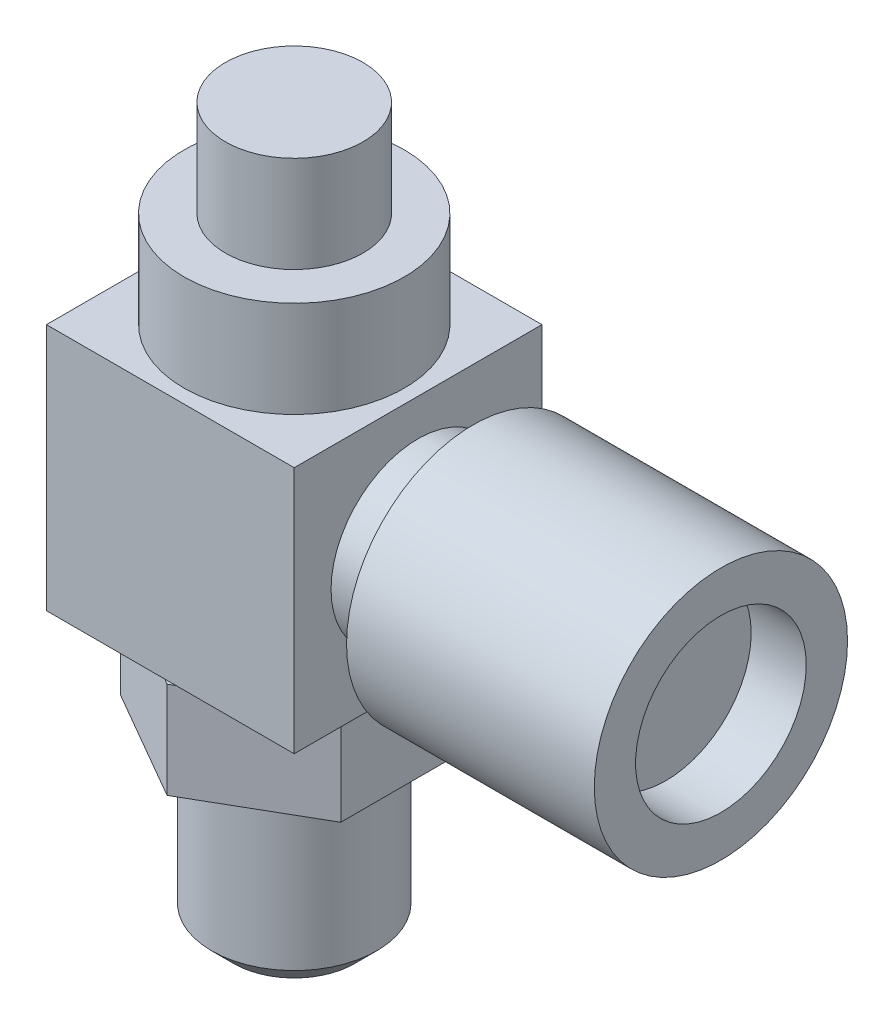
ISO-10303-21;
HEADER;
FILE_DESCRIPTION(('STEP AP214'),'2;1');
FILE_NAME('part.step','',(''),(''),'','','');
FILE_SCHEMA(('AUTOMOTIVE_DESIGN { 1 0 10303 214 1 1 1 1 }'));
ENDSEC;
DATA;
#1=APPLICATION_CONTEXT('core data for automotive mechanical design processes');
#2=APPLICATION_PROTOCOL_DEFINITION('international standard','automotive_design',2000,#1);
#3=PRODUCT_CONTEXT('',#1,'mechanical');
#4=PRODUCT('Part','Part','',(#3));
#5=PRODUCT_RELATED_PRODUCT_CATEGORY('part','',(#4));
#6=PRODUCT_DEFINITION_FORMATION('','',#4);
#7=PRODUCT_DEFINITION_CONTEXT('part definition',#1,'design');
#8=PRODUCT_DEFINITION('design','',#6,#7);
#9=PRODUCT_DEFINITION_SHAPE('','',#8);
#10=(LENGTH_UNIT() NAMED_UNIT(*) SI_UNIT(.MILLI.,.METRE.));
#11=(NAMED_UNIT(*) PLANE_ANGLE_UNIT() SI_UNIT($,.RADIAN.));
#12=(NAMED_UNIT(*) SI_UNIT($,.STERADIAN.) SOLID_ANGLE_UNIT());
#13=UNCERTAINTY_MEASURE_WITH_UNIT(LENGTH_MEASURE(1.E-05),#10,'distance_accuracy_value','');
#14=(GEOMETRIC_REPRESENTATION_CONTEXT(3) GLOBAL_UNCERTAINTY_ASSIGNED_CONTEXT((#13)) GLOBAL_UNIT_ASSIGNED_CONTEXT((#10,
#11,#12)) REPRESENTATION_CONTEXT('',''));
#15=CARTESIAN_POINT('',(0.,0.,0.));
#16=DIRECTION('',(0.,0.,1.));
#17=DIRECTION('',(1.,0.,0.));
#18=AXIS2_PLACEMENT_3D('',#15,#16,#17);
#19=CARTESIAN_POINT('',(0.,-16.,4.61880215351701));
#20=DIRECTION('',(0.,1.,0.));
#21=DIRECTION('',(0.,0.,1.));
#22=AXIS2_PLACEMENT_3D('',#19,#20,#21);
#23=PLANE('',#22);
#24=CARTESIAN_POINT('',(0.,-16.,0.));
#25=DIRECTION('',(0.,1.,0.));
#26=DIRECTION('',(0.,0.,1.));
#27=AXIS2_PLACEMENT_3D('',#24,#25,#26);
#28=CIRCLE('',#27,2.);
#29=CARTESIAN_POINT('',(0.,-16.,2.));
#30=VERTEX_POINT('',#29);
#31=EDGE_CURVE('E19',#30,#30,#28,.F.);
#32=ORIENTED_EDGE('',*,*,#31,.T.);
#33=EDGE_LOOP('',(#32));
#34=FACE_BOUND('',#33,.T.);
#35=ADVANCED_FACE('F16',(#34),#23,.F.);
#36=CARTESIAN_POINT('',(0.,-22.5,0.));
#37=DIRECTION('',(0.,1.,0.));
#38=DIRECTION('',(0.,0.,1.));
#39=AXIS2_PLACEMENT_3D('',#36,#37,#38);
#40=CYLINDRICAL_SURFACE('',#39,2.);
#41=CARTESIAN_POINT('',(0.,-22.5,0.));
#42=DIRECTION('',(0.,1.,0.));
#43=DIRECTION('',(0.,0.,1.));
#44=AXIS2_PLACEMENT_3D('',#41,#42,#43);
#45=CIRCLE('',#44,2.);
#46=CARTESIAN_POINT('',(0.,-22.5,2.));
#47=VERTEX_POINT('',#46);
#48=EDGE_CURVE('E172',#47,#47,#45,.T.);
#49=ORIENTED_EDGE('',*,*,#48,.F.);
#50=EDGE_LOOP('',(#49));
#51=FACE_BOUND('',#50,.T.);
#52=ORIENTED_EDGE('',*,*,#31,.F.);
#53=EDGE_LOOP('',(#52));
#54=FACE_BOUND('',#53,.T.);
#55=ADVANCED_FACE('F180',(#51,#54),#40,.F.);
#56=CARTESIAN_POINT('',(0.,-22.5,0.));
#57=DIRECTION('',(0.,-1.,0.));
#58=DIRECTION('',(0.,0.,-1.));
#59=AXIS2_PLACEMENT_3D('',#56,#57,#58);
#60=PLANE('',#59);
#61=ORIENTED_EDGE('',*,*,#48,.T.);
#62=EDGE_LOOP('',(#61));
#63=FACE_BOUND('',#62,.T.);
#64=CARTESIAN_POINT('',(0.,-22.4999999999795,0.));
#65=DIRECTION('',(0.,1.,0.));
#66=DIRECTION('',(0.,0.,1.));
#67=AXIS2_PLACEMENT_3D('',#64,#65,#66);
#68=CIRCLE('',#67,2.20000000001619);
#69=CARTESIAN_POINT('',(0.,-22.4999999999795,2.20000000001619));
#70=VERTEX_POINT('',#69);
#71=EDGE_CURVE('E137',#70,#70,#68,.T.);
#72=ORIENTED_EDGE('',*,*,#71,.F.);
#73=EDGE_LOOP('',(#72));
#74=FACE_BOUND('',#73,.T.);
#75=ADVANCED_FACE('F182',(#63,#74),#60,.T.);
#76=CARTESIAN_POINT('',(0.,-21.7000000000667,0.));
#77=DIRECTION('',(0.,1.,0.));
#78=DIRECTION('',(0.,0.,1.));
#79=AXIS2_PLACEMENT_3D('',#76,#77,#78);
#80=CONICAL_SURFACE('',#79,2.9999999999859,0.785398163432975);
#81=ORIENTED_EDGE('',*,*,#71,.T.);
#82=EDGE_LOOP('',(#81));
#83=FACE_BOUND('',#82,.T.);
#84=CARTESIAN_POINT('',(0.,-21.7,0.));
#85=DIRECTION('',(0.,1.,0.));
#86=DIRECTION('',(0.,0.,1.));
#87=AXIS2_PLACEMENT_3D('',#84,#85,#86);
#88=CIRCLE('',#87,3.);
#89=CARTESIAN_POINT('',(0.,-21.7,3.));
#90=VERTEX_POINT('',#89);
#91=EDGE_CURVE('E134',#90,#90,#88,.T.);
#92=ORIENTED_EDGE('',*,*,#91,.F.);
#93=EDGE_LOOP('',(#92));
#94=FACE_BOUND('',#93,.T.);
#95=ADVANCED_FACE('F189',(#83,#94),#80,.T.);
#96=CARTESIAN_POINT('',(0.,3.5,0.));
#97=DIRECTION('',(0.,1.,0.));
#98=DIRECTION('',(0.,0.,1.));
#99=AXIS2_PLACEMENT_3D('',#96,#97,#98);
#100=PLANE('',#99);
#101=CARTESIAN_POINT('',(0.,3.5,0.));
#102=DIRECTION('',(0.,-1.,0.));
#103=DIRECTION('',(0.,0.,-1.));
#104=AXIS2_PLACEMENT_3D('',#101,#102,#103);
#105=CIRCLE('',#104,2.5);
#106=CARTESIAN_POINT('',(0.,3.5,-2.5));
#107=VERTEX_POINT('',#106);
#108=EDGE_CURVE('E136',#107,#107,#105,.T.);
#109=ORIENTED_EDGE('',*,*,#108,.F.);
#110=EDGE_LOOP('',(#109));
#111=FACE_BOUND('',#110,.T.);
#112=ADVANCED_FACE('F292',(#111),#100,.T.);
#113=CARTESIAN_POINT('',(0.,-22.5,0.));
#114=DIRECTION('',(0.,1.,0.));
#115=DIRECTION('',(0.,0.,1.));
#116=AXIS2_PLACEMENT_3D('',#113,#114,#115);
#117=CYLINDRICAL_SURFACE('',#116,3.);
#118=ORIENTED_EDGE('',*,*,#91,.T.);
#119=EDGE_LOOP('',(#118));
#120=FACE_BOUND('',#119,.T.);
#121=CARTESIAN_POINT('',(0.,-16.,0.));
#122=DIRECTION('',(0.,1.,0.));
#123=DIRECTION('',(0.,0.,1.));
#124=AXIS2_PLACEMENT_3D('',#121,#122,#123);
#125=CIRCLE('',#124,3.);
#126=CARTESIAN_POINT('',(0.,-16.,3.));
#127=VERTEX_POINT('',#126);
#128=EDGE_CURVE('E114',#127,#127,#125,.F.);
#129=ORIENTED_EDGE('',*,*,#128,.T.);
#130=EDGE_LOOP('',(#129));
#131=FACE_BOUND('',#130,.T.);
#132=ADVANCED_FACE('F288',(#120,#131),#117,.T.);
#133=CARTESIAN_POINT('',(0.,3.5,0.));
#134=DIRECTION('',(0.,-1.,0.));
#135=DIRECTION('',(0.,0.,-1.));
#136=AXIS2_PLACEMENT_3D('',#133,#134,#135);
#137=CYLINDRICAL_SURFACE('',#136,2.5);
#138=CARTESIAN_POINT('',(0.,0.,0.));
#139=DIRECTION('',(0.,-1.,0.));
#140=DIRECTION('',(0.,0.,-1.));
#141=AXIS2_PLACEMENT_3D('',#138,#139,#140);
#142=CIRCLE('',#141,2.5);
#143=CARTESIAN_POINT('',(0.,0.,-2.5));
#144=VERTEX_POINT('',#143);
#145=EDGE_CURVE('E129',#144,#144,#142,.F.);
#146=ORIENTED_EDGE('',*,*,#145,.T.);
#147=EDGE_LOOP('',(#146));
#148=FACE_BOUND('',#147,.T.);
#149=ORIENTED_EDGE('',*,*,#108,.T.);
#150=EDGE_LOOP('',(#149));
#151=FACE_BOUND('',#150,.T.);
#152=ADVANCED_FACE('F284',(#148,#151),#137,.T.);
#153=CARTESIAN_POINT('',(0.,-16.,4.61880215351701));
#154=DIRECTION('',(0.,1.,0.));
#155=DIRECTION('',(0.,0.,1.));
#156=AXIS2_PLACEMENT_3D('',#153,#154,#155);
#157=PLANE('',#156);
#158=ORIENTED_EDGE('',*,*,#128,.F.);
#159=EDGE_LOOP('',(#158));
#160=FACE_BOUND('',#159,.T.);
#161=DIRECTION('',(0.,0.,-1.));
#162=VECTOR('',#161,1.);
#163=CARTESIAN_POINT('',(-4.,-16.,-2.3094010767585));
#164=LINE('',#163,#162);
#165=CARTESIAN_POINT('',(-4.,-16.,2.3094010767585));
#166=VERTEX_POINT('',#165);
#167=CARTESIAN_POINT('',(-4.,-16.,-2.3094010767585));
#168=VERTEX_POINT('',#167);
#169=EDGE_CURVE('E103',#166,#168,#164,.T.);
#170=ORIENTED_EDGE('',*,*,#169,.T.);
#171=DIRECTION('',(0.866025403784439,0.,-0.5));
#172=VECTOR('',#171,1.);
#173=CARTESIAN_POINT('',(0.,-16.,-4.61880215351701));
#174=LINE('',#173,#172);
#175=CARTESIAN_POINT('',(0.,-16.,-4.61880215351701));
#176=VERTEX_POINT('',#175);
#177=EDGE_CURVE('E113',#168,#176,#174,.T.);
#178=ORIENTED_EDGE('',*,*,#177,.T.);
#179=DIRECTION('',(0.866025403784439,0.,0.5));
#180=VECTOR('',#179,1.);
#181=CARTESIAN_POINT('',(4.,-16.,-2.3094010767585));
#182=LINE('',#181,#180);
#183=CARTESIAN_POINT('',(4.,-16.,-2.3094010767585));
#184=VERTEX_POINT('',#183);
#185=EDGE_CURVE('E554',#176,#184,#182,.T.);
#186=ORIENTED_EDGE('',*,*,#185,.T.);
#187=DIRECTION('',(0.,0.,1.));
#188=VECTOR('',#187,1.);
#189=CARTESIAN_POINT('',(4.,-16.,2.3094010767585));
#190=LINE('',#189,#188);
#191=CARTESIAN_POINT('',(4.,-16.,2.3094010767585));
#192=VERTEX_POINT('',#191);
#193=EDGE_CURVE('E558',#184,#192,#190,.T.);
#194=ORIENTED_EDGE('',*,*,#193,.T.);
#195=DIRECTION('',(-0.866025403784438,0.,0.5));
#196=VECTOR('',#195,1.);
#197=CARTESIAN_POINT('',(0.,-16.,4.61880215351701));
#198=LINE('',#197,#196);
#199=CARTESIAN_POINT('',(0.,-16.,4.61880215351701));
#200=VERTEX_POINT('',#199);
#201=EDGE_CURVE('E110',#192,#200,#198,.T.);
#202=ORIENTED_EDGE('',*,*,#201,.T.);
#203=DIRECTION('',(-0.866025403784438,0.,-0.500000000000001));
#204=VECTOR('',#203,1.);
#205=CARTESIAN_POINT('',(-4.,-16.,2.3094010767585));
#206=LINE('',#205,#204);
#207=EDGE_CURVE('E106',#200,#166,#206,.T.);
#208=ORIENTED_EDGE('',*,*,#207,.T.);
#209=EDGE_LOOP('',(#170,#178,#186,#194,#202,#208));
#210=FACE_BOUND('',#209,.T.);
#211=ADVANCED_FACE('F108',(#160,#210),#157,.F.);
#212=CARTESIAN_POINT('',(-4.,-16.,2.3094010767585));
#213=DIRECTION('',(0.500000000000001,0.,-0.866025403784438));
#214=DIRECTION('',(-0.866025403784438,0.,-0.500000000000001));
#215=AXIS2_PLACEMENT_3D('',#212,#213,#214);
#216=PLANE('',#215);
#217=DIRECTION('',(0.866025403784438,0.,0.500000000000001));
#218=VECTOR('',#217,1.);
#219=CARTESIAN_POINT('',(-4.,-12.5,2.3094010767585));
#220=LINE('',#219,#218);
#221=CARTESIAN_POINT('',(-4.,-12.5,2.3094010767585));
#222=VERTEX_POINT('',#221);
#223=CARTESIAN_POINT('',(-0.20577136594006,-12.5,4.5));
#224=VERTEX_POINT('',#223);
#225=EDGE_CURVE('E120',#222,#224,#220,.T.);
#226=ORIENTED_EDGE('',*,*,#225,.F.);
#227=DIRECTION('',(0.,1.,0.));
#228=VECTOR('',#227,1.);
#229=CARTESIAN_POINT('',(-4.,-16.,2.3094010767585));
#230=LINE('',#229,#228);
#231=EDGE_CURVE('E117',#222,#166,#230,.F.);
#232=ORIENTED_EDGE('',*,*,#231,.T.);
#233=ORIENTED_EDGE('',*,*,#207,.F.);
#234=DIRECTION('',(0.,1.,0.));
#235=VECTOR('',#234,1.);
#236=CARTESIAN_POINT('',(0.,-16.,4.61880215351701));
#237=LINE('',#236,#235);
#238=CARTESIAN_POINT('',(0.,-12.5,4.61880215351701));
#239=VERTEX_POINT('',#238);
#240=EDGE_CURVE('E563',#200,#239,#237,.T.);
#241=ORIENTED_EDGE('',*,*,#240,.T.);
#242=DIRECTION('',(0.86602540378444,0.,0.499999999999998));
#243=VECTOR('',#242,1.);
#244=CARTESIAN_POINT('',(-0.20577136594006,-12.5,4.5));
#245=LINE('',#244,#243);
#246=EDGE_CURVE('E567',#224,#239,#245,.T.);
#247=ORIENTED_EDGE('',*,*,#246,.F.);
#248=EDGE_LOOP('',(#226,#232,#233,#241,#247));
#249=FACE_BOUND('',#248,.T.);
#250=ADVANCED_FACE('F118',(#249),#216,.F.);
#251=CARTESIAN_POINT('',(0.,-16.,-4.61880215351701));
#252=DIRECTION('',(0.5,0.,0.866025403784439));
#253=DIRECTION('',(0.866025403784439,0.,-0.5));
#254=AXIS2_PLACEMENT_3D('',#251,#252,#253);
#255=PLANE('',#254);
#256=DIRECTION('',(-0.866025403784437,0.,0.500000000000003));
#257=VECTOR('',#256,1.);
#258=CARTESIAN_POINT('',(0.,-12.5,-4.61880215351701));
#259=LINE('',#258,#257);
#260=CARTESIAN_POINT('',(0.,-12.5,-4.61880215351701));
#261=VERTEX_POINT('',#260);
#262=CARTESIAN_POINT('',(-0.205771365940048,-12.5,-4.5));
#263=VERTEX_POINT('',#262);
#264=EDGE_CURVE('E166',#261,#263,#259,.T.);
#265=ORIENTED_EDGE('',*,*,#264,.F.);
#266=DIRECTION('',(0.,1.,0.));
#267=VECTOR('',#266,1.);
#268=CARTESIAN_POINT('',(0.,-16.,-4.61880215351701));
#269=LINE('',#268,#267);
#270=EDGE_CURVE('E539',#261,#176,#269,.F.);
#271=ORIENTED_EDGE('',*,*,#270,.T.);
#272=ORIENTED_EDGE('',*,*,#177,.F.);
#273=DIRECTION('',(0.,1.,0.));
#274=VECTOR('',#273,1.);
#275=CARTESIAN_POINT('',(-4.,-16.,-2.3094010767585));
#276=LINE('',#275,#274);
#277=CARTESIAN_POINT('',(-4.,-12.5,-2.3094010767585));
#278=VERTEX_POINT('',#277);
#279=EDGE_CURVE('E127',#168,#278,#276,.T.);
#280=ORIENTED_EDGE('',*,*,#279,.T.);
#281=DIRECTION('',(-0.866025403784439,0.,0.5));
#282=VECTOR('',#281,1.);
#283=CARTESIAN_POINT('',(-0.205771365940047,-12.5,-4.5));
#284=LINE('',#283,#282);
#285=EDGE_CURVE('E542',#263,#278,#284,.T.);
#286=ORIENTED_EDGE('',*,*,#285,.F.);
#287=EDGE_LOOP('',(#265,#271,#272,#280,#286));
#288=FACE_BOUND('',#287,.T.);
#289=ADVANCED_FACE('F276',(#288),#255,.F.);
#290=CARTESIAN_POINT('',(-4.,-16.,-2.3094010767585));
#291=DIRECTION('',(1.,0.,0.));
#292=DIRECTION('',(0.,0.,-1.));
#293=AXIS2_PLACEMENT_3D('',#290,#291,#292);
#294=PLANE('',#293);
#295=ORIENTED_EDGE('',*,*,#279,.F.);
#296=ORIENTED_EDGE('',*,*,#169,.F.);
#297=ORIENTED_EDGE('',*,*,#231,.F.);
#298=DIRECTION('',(0.,0.,-1.));
#299=VECTOR('',#298,1.);
#300=CARTESIAN_POINT('',(-4.,-12.5,-4.5));
#301=LINE('',#300,#299);
#302=EDGE_CURVE('E599',#278,#222,#301,.F.);
#303=ORIENTED_EDGE('',*,*,#302,.F.);
#304=EDGE_LOOP('',(#295,#296,#297,#303));
#305=FACE_BOUND('',#304,.T.);
#306=ADVANCED_FACE('F126',(#305),#294,.F.);
#307=CARTESIAN_POINT('',(0.,0.,0.));
#308=DIRECTION('',(0.,-1.,0.));
#309=DIRECTION('',(0.,0.,-1.));
#310=AXIS2_PLACEMENT_3D('',#307,#308,#309);
#311=PLANE('',#310);
#312=ORIENTED_EDGE('',*,*,#145,.F.);
#313=EDGE_LOOP('',(#312));
#314=FACE_BOUND('',#313,.T.);
#315=CARTESIAN_POINT('',(0.,0.,0.));
#316=DIRECTION('',(0.,1.,0.));
#317=DIRECTION('',(0.,0.,1.));
#318=AXIS2_PLACEMENT_3D('',#315,#316,#317);
#319=CIRCLE('',#318,4.);
#320=CARTESIAN_POINT('',(0.,0.,4.));
#321=VERTEX_POINT('',#320);
#322=EDGE_CURVE('E159',#321,#321,#319,.F.);
#323=ORIENTED_EDGE('',*,*,#322,.F.);
#324=EDGE_LOOP('',(#323));
#325=FACE_BOUND('',#324,.T.);
#326=ADVANCED_FACE('F269',(#314,#325),#311,.F.);
#327=CARTESIAN_POINT('',(0.,-12.5,4.61880215351701));
#328=DIRECTION('',(0.,1.,0.));
#329=DIRECTION('',(0.,0.,1.));
#330=AXIS2_PLACEMENT_3D('',#327,#328,#329);
#331=PLANE('',#330);
#332=DIRECTION('',(1.,0.,0.));
#333=VECTOR('',#332,1.);
#334=CARTESIAN_POINT('',(-4.5,-12.5,-4.5));
#335=LINE('',#334,#333);
#336=CARTESIAN_POINT('',(0.205771365940052,-12.5,-4.5));
#337=VERTEX_POINT('',#336);
#338=EDGE_CURVE('E547',#263,#337,#335,.T.);
#339=ORIENTED_EDGE('',*,*,#338,.T.);
#340=DIRECTION('',(0.866025403784439,0.,0.5));
#341=VECTOR('',#340,1.);
#342=CARTESIAN_POINT('',(4.,-12.5,-2.3094010767585));
#343=LINE('',#342,#341);
#344=EDGE_CURVE('E546',#337,#261,#343,.F.);
#345=ORIENTED_EDGE('',*,*,#344,.T.);
#346=ORIENTED_EDGE('',*,*,#264,.T.);
#347=EDGE_LOOP('',(#339,#345,#346));
#348=FACE_BOUND('',#347,.T.);
#349=ADVANCED_FACE('F265',(#348),#331,.T.);
#350=CARTESIAN_POINT('',(0.,-16.,4.61880215351701));
#351=DIRECTION('',(-0.5,0.,-0.866025403784438));
#352=DIRECTION('',(-0.866025403784438,0.,0.5));
#353=AXIS2_PLACEMENT_3D('',#350,#351,#352);
#354=PLANE('',#353);
#355=DIRECTION('',(0.866025403784442,0.,-0.499999999999993));
#356=VECTOR('',#355,1.);
#357=CARTESIAN_POINT('',(0.,-12.5,4.61880215351701));
#358=LINE('',#357,#356);
#359=CARTESIAN_POINT('',(0.205771365940061,-12.5,4.5));
#360=VERTEX_POINT('',#359);
#361=EDGE_CURVE('E550',#239,#360,#358,.T.);
#362=ORIENTED_EDGE('',*,*,#361,.F.);
#363=ORIENTED_EDGE('',*,*,#240,.F.);
#364=ORIENTED_EDGE('',*,*,#201,.F.);
#365=DIRECTION('',(0.,1.,0.));
#366=VECTOR('',#365,1.);
#367=CARTESIAN_POINT('',(4.,-16.,2.3094010767585));
#368=LINE('',#367,#366);
#369=CARTESIAN_POINT('',(4.,-12.5,2.3094010767585));
#370=VERTEX_POINT('',#369);
#371=EDGE_CURVE('E555',#192,#370,#368,.T.);
#372=ORIENTED_EDGE('',*,*,#371,.T.);
#373=DIRECTION('',(0.866025403784438,0.,-0.500000000000001));
#374=VECTOR('',#373,1.);
#375=CARTESIAN_POINT('',(0.205771365940063,-12.5,4.5));
#376=LINE('',#375,#374);
#377=EDGE_CURVE('E571',#360,#370,#376,.T.);
#378=ORIENTED_EDGE('',*,*,#377,.F.);
#379=EDGE_LOOP('',(#362,#363,#364,#372,#378));
#380=FACE_BOUND('',#379,.T.);
#381=ADVANCED_FACE('F261',(#380),#354,.F.);
#382=CARTESIAN_POINT('',(4.,-16.,2.3094010767585));
#383=DIRECTION('',(-1.,0.,0.));
#384=DIRECTION('',(0.,0.,1.));
#385=AXIS2_PLACEMENT_3D('',#382,#383,#384);
#386=PLANE('',#385);
#387=ORIENTED_EDGE('',*,*,#371,.F.);
#388=ORIENTED_EDGE('',*,*,#193,.F.);
#389=DIRECTION('',(0.,1.,0.));
#390=VECTOR('',#389,1.);
#391=CARTESIAN_POINT('',(4.,-16.,-2.3094010767585));
#392=LINE('',#391,#390);
#393=CARTESIAN_POINT('',(4.,-12.5,-2.3094010767585));
#394=VERTEX_POINT('',#393);
#395=EDGE_CURVE('E551',#184,#394,#392,.T.);
#396=ORIENTED_EDGE('',*,*,#395,.T.);
#397=DIRECTION('',(0.,0.,-1.));
#398=VECTOR('',#397,1.);
#399=CARTESIAN_POINT('',(4.,-12.5,-4.5));
#400=LINE('',#399,#398);
#401=EDGE_CURVE('E583',#370,#394,#400,.T.);
#402=ORIENTED_EDGE('',*,*,#401,.F.);
#403=EDGE_LOOP('',(#387,#388,#396,#402));
#404=FACE_BOUND('',#403,.T.);
#405=ADVANCED_FACE('F257',(#404),#386,.F.);
#406=CARTESIAN_POINT('',(4.,-16.,-2.3094010767585));
#407=DIRECTION('',(-0.5,0.,0.866025403784439));
#408=DIRECTION('',(0.866025403784439,0.,0.5));
#409=AXIS2_PLACEMENT_3D('',#406,#407,#408);
#410=PLANE('',#409);
#411=DIRECTION('',(-0.866025403784439,0.,-0.5));
#412=VECTOR('',#411,1.);
#413=CARTESIAN_POINT('',(4.,-12.5,-2.3094010767585));
#414=LINE('',#413,#412);
#415=EDGE_CURVE('E585',#394,#337,#414,.T.);
#416=ORIENTED_EDGE('',*,*,#415,.F.);
#417=ORIENTED_EDGE('',*,*,#395,.F.);
#418=ORIENTED_EDGE('',*,*,#185,.F.);
#419=ORIENTED_EDGE('',*,*,#270,.F.);
#420=ORIENTED_EDGE('',*,*,#344,.F.);
#421=EDGE_LOOP('',(#416,#417,#418,#419,#420));
#422=FACE_BOUND('',#421,.T.);
#423=ADVANCED_FACE('F253',(#422),#410,.F.);
#424=CARTESIAN_POINT('',(0.,-12.5,4.61880215351701));
#425=DIRECTION('',(0.,1.,0.));
#426=DIRECTION('',(0.,0.,1.));
#427=AXIS2_PLACEMENT_3D('',#424,#425,#426);
#428=PLANE('',#427);
#429=DIRECTION('',(-1.,0.,0.));
#430=VECTOR('',#429,1.);
#431=CARTESIAN_POINT('',(-4.5,-12.5,4.5));
#432=LINE('',#431,#430);
#433=EDGE_CURVE('E575',#360,#224,#432,.T.);
#434=ORIENTED_EDGE('',*,*,#433,.T.);
#435=ORIENTED_EDGE('',*,*,#246,.T.);
#436=ORIENTED_EDGE('',*,*,#361,.T.);
#437=EDGE_LOOP('',(#434,#435,#436));
#438=FACE_BOUND('',#437,.T.);
#439=ADVANCED_FACE('F249',(#438),#428,.T.);
#440=CARTESIAN_POINT('',(-4.5,-12.5,-4.5));
#441=DIRECTION('',(0.,-1.,0.));
#442=DIRECTION('',(0.,0.,-1.));
#443=AXIS2_PLACEMENT_3D('',#440,#441,#442);
#444=PLANE('',#443);
#445=ORIENTED_EDGE('',*,*,#285,.T.);
#446=ORIENTED_EDGE('',*,*,#302,.T.);
#447=ORIENTED_EDGE('',*,*,#225,.T.);
#448=DIRECTION('',(-1.,0.,0.));
#449=VECTOR('',#448,1.);
#450=CARTESIAN_POINT('',(-4.5,-12.5,4.5));
#451=LINE('',#450,#449);
#452=CARTESIAN_POINT('',(-4.5,-12.5,4.5));
#453=VERTEX_POINT('',#452);
#454=EDGE_CURVE('E609',#224,#453,#451,.T.);
#455=ORIENTED_EDGE('',*,*,#454,.T.);
#456=DIRECTION('',(0.,0.,-1.));
#457=VECTOR('',#456,1.);
#458=CARTESIAN_POINT('',(-4.5,-12.5,4.5));
#459=LINE('',#458,#457);
#460=CARTESIAN_POINT('',(-4.5,-12.5,-4.5));
#461=VERTEX_POINT('',#460);
#462=EDGE_CURVE('E163',#453,#461,#459,.T.);
#463=ORIENTED_EDGE('',*,*,#462,.T.);
#464=DIRECTION('',(1.,0.,0.));
#465=VECTOR('',#464,1.);
#466=CARTESIAN_POINT('',(-4.5,-12.5,-4.5));
#467=LINE('',#466,#465);
#468=EDGE_CURVE('E594',#461,#263,#467,.T.);
#469=ORIENTED_EDGE('',*,*,#468,.T.);
#470=EDGE_LOOP('',(#445,#446,#447,#455,#463,#469));
#471=FACE_BOUND('',#470,.T.);
#472=ADVANCED_FACE('F245',(#471),#444,.T.);
#473=CARTESIAN_POINT('',(-4.5,-12.5,4.5));
#474=DIRECTION('',(1.,0.,0.));
#475=DIRECTION('',(0.,0.,-1.));
#476=AXIS2_PLACEMENT_3D('',#473,#474,#475);
#477=PLANE('',#476);
#478=DIRECTION('',(0.,1.,0.));
#479=VECTOR('',#478,1.);
#480=CARTESIAN_POINT('',(-4.5,-12.5,-4.5));
#481=LINE('',#480,#479);
#482=CARTESIAN_POINT('',(-4.5,-3.5,-4.5));
#483=VERTEX_POINT('',#482);
#484=EDGE_CURVE('E162',#483,#461,#481,.F.);
#485=ORIENTED_EDGE('',*,*,#484,.T.);
#486=ORIENTED_EDGE('',*,*,#462,.F.);
#487=DIRECTION('',(0.,1.,0.));
#488=VECTOR('',#487,1.);
#489=CARTESIAN_POINT('',(-4.5,-12.5,4.5));
#490=LINE('',#489,#488);
#491=CARTESIAN_POINT('',(-4.5,-3.5,4.5));
#492=VERTEX_POINT('',#491);
#493=EDGE_CURVE('E611',#453,#492,#490,.T.);
#494=ORIENTED_EDGE('',*,*,#493,.T.);
#495=DIRECTION('',(0.,0.,-1.));
#496=VECTOR('',#495,1.);
#497=CARTESIAN_POINT('',(-4.5,-3.5,-4.5));
#498=LINE('',#497,#496);
#499=EDGE_CURVE('E158',#492,#483,#498,.T.);
#500=ORIENTED_EDGE('',*,*,#499,.T.);
#501=EDGE_LOOP('',(#485,#486,#494,#500));
#502=FACE_BOUND('',#501,.T.);
#503=ADVANCED_FACE('F241',(#502),#477,.F.);
#504=CARTESIAN_POINT('',(0.,-3.5,0.));
#505=DIRECTION('',(0.,1.,0.));
#506=DIRECTION('',(0.,0.,1.));
#507=AXIS2_PLACEMENT_3D('',#504,#505,#506);
#508=CYLINDRICAL_SURFACE('',#507,4.);
#509=CARTESIAN_POINT('',(0.,-3.5,0.));
#510=DIRECTION('',(0.,1.,0.));
#511=DIRECTION('',(0.,0.,1.));
#512=AXIS2_PLACEMENT_3D('',#509,#510,#511);
#513=CIRCLE('',#512,4.);
#514=CARTESIAN_POINT('',(0.,-3.5,4.));
#515=VERTEX_POINT('',#514);
#516=EDGE_CURVE('E154',#515,#515,#513,.T.);
#517=ORIENTED_EDGE('',*,*,#516,.T.);
#518=EDGE_LOOP('',(#517));
#519=FACE_BOUND('',#518,.T.);
#520=ORIENTED_EDGE('',*,*,#322,.T.);
#521=EDGE_LOOP('',(#520));
#522=FACE_BOUND('',#521,.T.);
#523=ADVANCED_FACE('F237',(#519,#522),#508,.T.);
#524=CARTESIAN_POINT('',(-4.5,-12.5,-4.5));
#525=DIRECTION('',(0.,0.,1.));
#526=DIRECTION('',(1.,0.,0.));
#527=AXIS2_PLACEMENT_3D('',#524,#525,#526);
#528=PLANE('',#527);
#529=DIRECTION('',(0.,1.,0.));
#530=VECTOR('',#529,1.);
#531=CARTESIAN_POINT('',(4.5,-12.5,-4.5));
#532=LINE('',#531,#530);
#533=CARTESIAN_POINT('',(4.5,-3.5,-4.5));
#534=VERTEX_POINT('',#533);
#535=CARTESIAN_POINT('',(4.5,-12.5,-4.5));
#536=VERTEX_POINT('',#535);
#537=EDGE_CURVE('E157',#534,#536,#532,.F.);
#538=ORIENTED_EDGE('',*,*,#537,.T.);
#539=DIRECTION('',(1.,0.,0.));
#540=VECTOR('',#539,1.);
#541=CARTESIAN_POINT('',(-4.5,-12.5,-4.5));
#542=LINE('',#541,#540);
#543=EDGE_CURVE('E587',#337,#536,#542,.T.);
#544=ORIENTED_EDGE('',*,*,#543,.F.);
#545=ORIENTED_EDGE('',*,*,#338,.F.);
#546=ORIENTED_EDGE('',*,*,#468,.F.);
#547=ORIENTED_EDGE('',*,*,#484,.F.);
#548=DIRECTION('',(1.,0.,0.));
#549=VECTOR('',#548,1.);
#550=CARTESIAN_POINT('',(-4.5,-3.5,-4.5));
#551=LINE('',#550,#549);
#552=EDGE_CURVE('E613',#483,#534,#551,.T.);
#553=ORIENTED_EDGE('',*,*,#552,.T.);
#554=EDGE_LOOP('',(#538,#544,#545,#546,#547,#553));
#555=FACE_BOUND('',#554,.T.);
#556=ADVANCED_FACE('F233',(#555),#528,.F.);
#557=CARTESIAN_POINT('',(-4.5,-12.5,-4.5));
#558=DIRECTION('',(0.,-1.,0.));
#559=DIRECTION('',(0.,0.,-1.));
#560=AXIS2_PLACEMENT_3D('',#557,#558,#559);
#561=PLANE('',#560);
#562=DIRECTION('',(0.,0.,1.));
#563=VECTOR('',#562,1.);
#564=CARTESIAN_POINT('',(4.5,-12.5,4.5));
#565=LINE('',#564,#563);
#566=CARTESIAN_POINT('',(4.5,-12.5,4.5));
#567=VERTEX_POINT('',#566);
#568=EDGE_CURVE('E619',#536,#567,#565,.T.);
#569=ORIENTED_EDGE('',*,*,#568,.T.);
#570=DIRECTION('',(-1.,0.,0.));
#571=VECTOR('',#570,1.);
#572=CARTESIAN_POINT('',(-4.5,-12.5,4.5));
#573=LINE('',#572,#571);
#574=EDGE_CURVE('E605',#567,#360,#573,.T.);
#575=ORIENTED_EDGE('',*,*,#574,.T.);
#576=ORIENTED_EDGE('',*,*,#377,.T.);
#577=ORIENTED_EDGE('',*,*,#401,.T.);
#578=ORIENTED_EDGE('',*,*,#415,.T.);
#579=ORIENTED_EDGE('',*,*,#543,.T.);
#580=EDGE_LOOP('',(#569,#575,#576,#577,#578,#579));
#581=FACE_BOUND('',#580,.T.);
#582=ADVANCED_FACE('F230',(#581),#561,.T.);
#583=CARTESIAN_POINT('',(-4.5,-12.5,4.5));
#584=DIRECTION('',(0.,0.,-1.));
#585=DIRECTION('',(-1.,0.,0.));
#586=AXIS2_PLACEMENT_3D('',#583,#584,#585);
#587=PLANE('',#586);
#588=ORIENTED_EDGE('',*,*,#493,.F.);
#589=ORIENTED_EDGE('',*,*,#454,.F.);
#590=ORIENTED_EDGE('',*,*,#433,.F.);
#591=ORIENTED_EDGE('',*,*,#574,.F.);
#592=DIRECTION('',(0.,1.,0.));
#593=VECTOR('',#592,1.);
#594=CARTESIAN_POINT('',(4.5,-12.5,4.5));
#595=LINE('',#594,#593);
#596=CARTESIAN_POINT('',(4.5,-3.5,4.5));
#597=VERTEX_POINT('',#596);
#598=EDGE_CURVE('E34',#567,#597,#595,.T.);
#599=ORIENTED_EDGE('',*,*,#598,.T.);
#600=DIRECTION('',(1.,0.,0.));
#601=VECTOR('',#600,1.);
#602=CARTESIAN_POINT('',(-4.5,-3.5,4.5));
#603=LINE('',#602,#601);
#604=EDGE_CURVE('E615',#597,#492,#603,.F.);
#605=ORIENTED_EDGE('',*,*,#604,.T.);
#606=EDGE_LOOP('',(#588,#589,#590,#591,#599,#605));
#607=FACE_BOUND('',#606,.T.);
#608=ADVANCED_FACE('F226',(#607),#587,.F.);
#609=CARTESIAN_POINT('',(-4.5,-3.5,-4.5));
#610=DIRECTION('',(0.,-1.,0.));
#611=DIRECTION('',(0.,0.,-1.));
#612=AXIS2_PLACEMENT_3D('',#609,#610,#611);
#613=PLANE('',#612);
#614=ORIENTED_EDGE('',*,*,#516,.F.);
#615=EDGE_LOOP('',(#614));
#616=FACE_BOUND('',#615,.T.);
#617=ORIENTED_EDGE('',*,*,#604,.F.);
#618=DIRECTION('',(0.,0.,1.));
#619=VECTOR('',#618,1.);
#620=CARTESIAN_POINT('',(4.5,-3.5,4.5));
#621=LINE('',#620,#619);
#622=EDGE_CURVE('E153',#597,#534,#621,.F.);
#623=ORIENTED_EDGE('',*,*,#622,.T.);
#624=ORIENTED_EDGE('',*,*,#552,.F.);
#625=ORIENTED_EDGE('',*,*,#499,.F.);
#626=EDGE_LOOP('',(#617,#623,#624,#625));
#627=FACE_BOUND('',#626,.T.);
#628=ADVANCED_FACE('F222',(#616,#627),#613,.F.);
#629=CARTESIAN_POINT('',(13.5,-8.,0.));
#630=DIRECTION('',(1.,0.,0.));
#631=DIRECTION('',(0.,0.,-1.));
#632=AXIS2_PLACEMENT_3D('',#629,#630,#631);
#633=PLANE('',#632);
#634=CARTESIAN_POINT('',(13.5,-8.,0.));
#635=DIRECTION('',(1.,0.,0.));
#636=DIRECTION('',(0.,0.,-1.));
#637=AXIS2_PLACEMENT_3D('',#634,#635,#636);
#638=CIRCLE('',#637,3.1);
#639=CARTESIAN_POINT('',(13.5,-8.,-3.1));
#640=VERTEX_POINT('',#639);
#641=EDGE_CURVE('E150',#640,#640,#638,.T.);
#642=ORIENTED_EDGE('',*,*,#641,.T.);
#643=EDGE_LOOP('',(#642));
#644=FACE_BOUND('',#643,.T.);
#645=ADVANCED_FACE('F218',(#644),#633,.T.);
#646=CARTESIAN_POINT('',(4.5,-12.5,4.5));
#647=DIRECTION('',(-1.,0.,0.));
#648=DIRECTION('',(0.,0.,1.));
#649=AXIS2_PLACEMENT_3D('',#646,#647,#648);
#650=PLANE('',#649);
#651=CARTESIAN_POINT('',(4.5,-8.,0.));
#652=DIRECTION('',(-1.,0.,0.));
#653=DIRECTION('',(0.,0.,1.));
#654=AXIS2_PLACEMENT_3D('',#651,#652,#653);
#655=CIRCLE('',#654,3.16213751630402);
#656=CARTESIAN_POINT('',(4.5,-8.,3.16213751630402));
#657=VERTEX_POINT('',#656);
#658=EDGE_CURVE('E147',#657,#657,#655,.F.);
#659=ORIENTED_EDGE('',*,*,#658,.F.);
#660=EDGE_LOOP('',(#659));
#661=FACE_BOUND('',#660,.T.);
#662=ORIENTED_EDGE('',*,*,#598,.F.);
#663=ORIENTED_EDGE('',*,*,#568,.F.);
#664=ORIENTED_EDGE('',*,*,#537,.F.);
#665=ORIENTED_EDGE('',*,*,#622,.F.);
#666=EDGE_LOOP('',(#662,#663,#664,#665));
#667=FACE_BOUND('',#666,.T.);
#668=ADVANCED_FACE('F214',(#661,#667),#650,.F.);
#669=CARTESIAN_POINT('',(13.5,-8.,0.));
#670=DIRECTION('',(1.,0.,0.));
#671=DIRECTION('',(0.,0.,-1.));
#672=AXIS2_PLACEMENT_3D('',#669,#670,#671);
#673=CYLINDRICAL_SURFACE('',#672,3.1);
#674=CARTESIAN_POINT('',(15.5,-8.,0.));
#675=DIRECTION('',(1.,0.,0.));
#676=DIRECTION('',(0.,0.,-1.));
#677=AXIS2_PLACEMENT_3D('',#674,#675,#676);
#678=CIRCLE('',#677,3.1);
#679=CARTESIAN_POINT('',(15.5,-8.,-3.1));
#680=VERTEX_POINT('',#679);
#681=EDGE_CURVE('E144',#680,#680,#678,.F.);
#682=ORIENTED_EDGE('',*,*,#681,.F.);
#683=EDGE_LOOP('',(#682));
#684=FACE_BOUND('',#683,.T.);
#685=ORIENTED_EDGE('',*,*,#641,.F.);
#686=EDGE_LOOP('',(#685));
#687=FACE_BOUND('',#686,.T.);
#688=ADVANCED_FACE('F210',(#684,#687),#673,.F.);
#689=CARTESIAN_POINT('',(6.5,-8.,0.));
#690=DIRECTION('',(-1.,0.,0.));
#691=DIRECTION('',(0.,0.,1.));
#692=AXIS2_PLACEMENT_3D('',#689,#690,#691);
#693=CYLINDRICAL_SURFACE('',#692,3.16213751630402);
#694=CARTESIAN_POINT('',(6.5,-8.,0.));
#695=DIRECTION('',(-1.,0.,0.));
#696=DIRECTION('',(0.,0.,1.));
#697=AXIS2_PLACEMENT_3D('',#694,#695,#696);
#698=CIRCLE('',#697,3.16213751630402);
#699=CARTESIAN_POINT('',(6.5,-8.,3.16213751630402));
#700=VERTEX_POINT('',#699);
#701=EDGE_CURVE('E141',#700,#700,#698,.T.);
#702=ORIENTED_EDGE('',*,*,#701,.T.);
#703=EDGE_LOOP('',(#702));
#704=FACE_BOUND('',#703,.T.);
#705=ORIENTED_EDGE('',*,*,#658,.T.);
#706=EDGE_LOOP('',(#705));
#707=FACE_BOUND('',#706,.T.);
#708=ADVANCED_FACE('F206',(#704,#707),#693,.T.);
#709=CARTESIAN_POINT('',(15.5,-8.,0.));
#710=DIRECTION('',(1.,0.,0.));
#711=DIRECTION('',(0.,0.,-1.));
#712=AXIS2_PLACEMENT_3D('',#709,#710,#711);
#713=PLANE('',#712);
#714=CARTESIAN_POINT('',(15.5,-8.,0.));
#715=DIRECTION('',(-1.,0.,0.));
#716=DIRECTION('',(0.,0.,1.));
#717=AXIS2_PLACEMENT_3D('',#714,#715,#716);
#718=CIRCLE('',#717,4.6);
#719=CARTESIAN_POINT('',(15.5,-8.,4.6));
#720=VERTEX_POINT('',#719);
#721=EDGE_CURVE('E25',#720,#720,#718,.T.);
#722=ORIENTED_EDGE('',*,*,#721,.F.);
#723=EDGE_LOOP('',(#722));
#724=FACE_BOUND('',#723,.T.);
#725=ORIENTED_EDGE('',*,*,#681,.T.);
#726=EDGE_LOOP('',(#725));
#727=FACE_BOUND('',#726,.T.);
#728=ADVANCED_FACE('F199',(#724,#727),#713,.T.);
#729=CARTESIAN_POINT('',(6.5,-8.,0.));
#730=DIRECTION('',(1.,0.,0.));
#731=DIRECTION('',(0.,0.,-1.));
#732=AXIS2_PLACEMENT_3D('',#729,#730,#731);
#733=PLANE('',#732);
#734=ORIENTED_EDGE('',*,*,#701,.F.);
#735=EDGE_LOOP('',(#734));
#736=FACE_BOUND('',#735,.T.);
#737=CARTESIAN_POINT('',(6.5,-8.,0.));
#738=DIRECTION('',(-1.,0.,0.));
#739=DIRECTION('',(0.,0.,1.));
#740=AXIS2_PLACEMENT_3D('',#737,#738,#739);
#741=CIRCLE('',#740,4.6);
#742=CARTESIAN_POINT('',(6.5,-8.,4.6));
#743=VERTEX_POINT('',#742);
#744=EDGE_CURVE('E11',#743,#743,#741,.F.);
#745=ORIENTED_EDGE('',*,*,#744,.F.);
#746=EDGE_LOOP('',(#745));
#747=FACE_BOUND('',#746,.T.);
#748=ADVANCED_FACE('F193',(#736,#747),#733,.F.);
#749=CARTESIAN_POINT('',(15.5,-8.,0.));
#750=DIRECTION('',(-1.,0.,0.));
#751=DIRECTION('',(0.,0.,1.));
#752=AXIS2_PLACEMENT_3D('',#749,#750,#751);
#753=CYLINDRICAL_SURFACE('',#752,4.6);
#754=ORIENTED_EDGE('',*,*,#744,.T.);
#755=EDGE_LOOP('',(#754));
#756=FACE_BOUND('',#755,.T.);
#757=ORIENTED_EDGE('',*,*,#721,.T.);
#758=EDGE_LOOP('',(#757));
#759=FACE_BOUND('',#758,.T.);
#760=ADVANCED_FACE('F191',(#756,#759),#753,.T.);
#761=CLOSED_SHELL('',(#35,#55,#75,#95,#112,#132,#152,#211,#250,#289,#306,#326,#349,#381,#405,
#423,#439,#472,#503,#523,#556,#582,#608,#628,#645,#668,#688,#708,#728,#748,#760));
#762=MANIFOLD_SOLID_BREP('B1',#761);
#763=ADVANCED_BREP_SHAPE_REPRESENTATION('',(#18,#762),#14);
#764=SHAPE_DEFINITION_REPRESENTATION(#9,#763);
ENDSEC;
END-ISO-10303-21;
